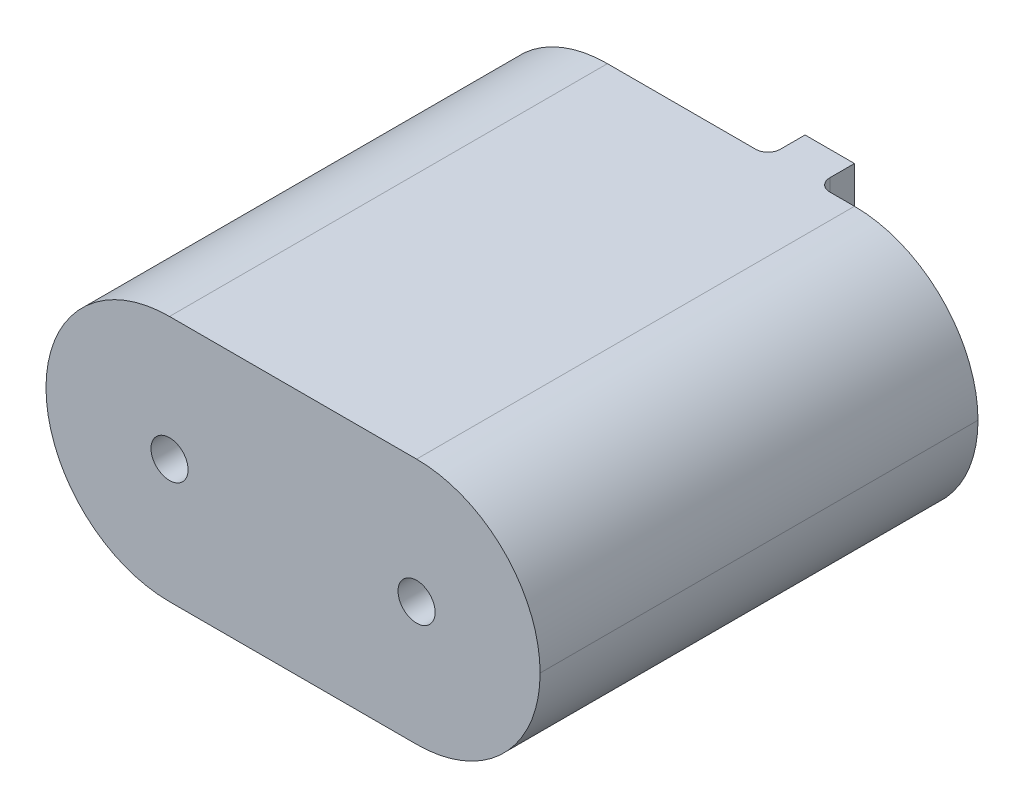
ISO-10303-21;
HEADER;
FILE_DESCRIPTION(('STEP AP214'),'2;1');
FILE_NAME('part.step','',(''),(''),'','','');
FILE_SCHEMA(('AUTOMOTIVE_DESIGN { 1 0 10303 214 1 1 1 1 }'));
ENDSEC;
DATA;
#1=APPLICATION_CONTEXT('core data for automotive mechanical design processes');
#2=APPLICATION_PROTOCOL_DEFINITION('international standard','automotive_design',2000,#1);
#3=PRODUCT_CONTEXT('',#1,'mechanical');
#4=PRODUCT('Part','Part','',(#3));
#5=PRODUCT_RELATED_PRODUCT_CATEGORY('part','',(#4));
#6=PRODUCT_DEFINITION_FORMATION('','',#4);
#7=PRODUCT_DEFINITION_CONTEXT('part definition',#1,'design');
#8=PRODUCT_DEFINITION('design','',#6,#7);
#9=PRODUCT_DEFINITION_SHAPE('','',#8);
#10=(LENGTH_UNIT() NAMED_UNIT(*) SI_UNIT(.MILLI.,.METRE.));
#11=(NAMED_UNIT(*) PLANE_ANGLE_UNIT() SI_UNIT($,.RADIAN.));
#12=(NAMED_UNIT(*) SI_UNIT($,.STERADIAN.) SOLID_ANGLE_UNIT());
#13=UNCERTAINTY_MEASURE_WITH_UNIT(LENGTH_MEASURE(1.E-05),#10,'distance_accuracy_value','');
#14=(GEOMETRIC_REPRESENTATION_CONTEXT(3) GLOBAL_UNCERTAINTY_ASSIGNED_CONTEXT((#13)) GLOBAL_UNIT_ASSIGNED_CONTEXT((#10,
#11,#12)) REPRESENTATION_CONTEXT('',''));
#15=CARTESIAN_POINT('',(0.,0.,0.));
#16=DIRECTION('',(0.,0.,1.));
#17=DIRECTION('',(1.,0.,0.));
#18=AXIS2_PLACEMENT_3D('',#15,#16,#17);
#19=CARTESIAN_POINT('',(3.,0.,-20.725));
#20=DIRECTION('',(-1.,0.,0.));
#21=DIRECTION('',(0.,-1.,0.));
#22=AXIS2_PLACEMENT_3D('',#19,#20,#21);
#23=PLANE('',#22);
#24=DIRECTION('',(0.,0.,1.));
#25=VECTOR('',#24,1.);
#26=CARTESIAN_POINT('',(3.,0.,-20.725));
#27=LINE('',#26,#25);
#28=CARTESIAN_POINT('',(3.,0.,-20.725));
#29=VERTEX_POINT('',#28);
#30=CARTESIAN_POINT('',(3.,0.,-18.725));
#31=VERTEX_POINT('',#30);
#32=EDGE_CURVE('E201',#29,#31,#27,.T.);
#33=ORIENTED_EDGE('',*,*,#32,.T.);
#34=DIRECTION('',(0.,-1.,0.));
#35=VECTOR('',#34,1.);
#36=CARTESIAN_POINT('',(3.,0.,-18.725));
#37=LINE('',#36,#35);
#38=CARTESIAN_POINT('',(3.,5.,-18.725));
#39=VERTEX_POINT('',#38);
#40=EDGE_CURVE('E285',#31,#39,#37,.F.);
#41=ORIENTED_EDGE('',*,*,#40,.T.);
#42=DIRECTION('',(0.,0.,1.));
#43=VECTOR('',#42,1.);
#44=CARTESIAN_POINT('',(3.,5.,-20.725));
#45=LINE('',#44,#43);
#46=CARTESIAN_POINT('',(3.,5.,-20.725));
#47=VERTEX_POINT('',#46);
#48=EDGE_CURVE('E326',#47,#39,#45,.T.);
#49=ORIENTED_EDGE('',*,*,#48,.F.);
#50=DIRECTION('',(0.,-1.,0.));
#51=VECTOR('',#50,1.);
#52=CARTESIAN_POINT('',(3.,0.,-20.725));
#53=LINE('',#52,#51);
#54=EDGE_CURVE('E325',#47,#29,#53,.T.);
#55=ORIENTED_EDGE('',*,*,#54,.T.);
#56=EDGE_LOOP('',(#33,#41,#49,#55));
#57=FACE_BOUND('',#56,.T.);
#58=ADVANCED_FACE('F48',(#57),#23,.T.);
#59=CARTESIAN_POINT('',(7.,0.,-20.725));
#60=DIRECTION('',(-1.,0.,0.));
#61=DIRECTION('',(0.,-1.,0.));
#62=AXIS2_PLACEMENT_3D('',#59,#60,#61);
#63=PLANE('',#62);
#64=DIRECTION('',(0.,0.,1.));
#65=VECTOR('',#64,1.);
#66=CARTESIAN_POINT('',(7.,5.,-20.725));
#67=LINE('',#66,#65);
#68=CARTESIAN_POINT('',(7.,5.,-20.725));
#69=VERTEX_POINT('',#68);
#70=CARTESIAN_POINT('',(7.,5.,-18.725));
#71=VERTEX_POINT('',#70);
#72=EDGE_CURVE('E330',#69,#71,#67,.T.);
#73=ORIENTED_EDGE('',*,*,#72,.T.);
#74=DIRECTION('',(0.,-1.,0.));
#75=VECTOR('',#74,1.);
#76=CARTESIAN_POINT('',(7.,0.,-18.725));
#77=LINE('',#76,#75);
#78=CARTESIAN_POINT('',(7.,0.,-18.725));
#79=VERTEX_POINT('',#78);
#80=EDGE_CURVE('E287',#71,#79,#77,.T.);
#81=ORIENTED_EDGE('',*,*,#80,.T.);
#82=DIRECTION('',(0.,0.,1.));
#83=VECTOR('',#82,1.);
#84=CARTESIAN_POINT('',(7.,0.,-20.725));
#85=LINE('',#84,#83);
#86=CARTESIAN_POINT('',(7.,0.,-20.725));
#87=VERTEX_POINT('',#86);
#88=EDGE_CURVE('E208',#87,#79,#85,.T.);
#89=ORIENTED_EDGE('',*,*,#88,.F.);
#90=DIRECTION('',(0.,-1.,0.));
#91=VECTOR('',#90,1.);
#92=CARTESIAN_POINT('',(7.,0.,-20.725));
#93=LINE('',#92,#91);
#94=EDGE_CURVE('E198',#69,#87,#93,.T.);
#95=ORIENTED_EDGE('',*,*,#94,.F.);
#96=EDGE_LOOP('',(#73,#81,#89,#95));
#97=FACE_BOUND('',#96,.T.);
#98=ADVANCED_FACE('F359',(#97),#63,.F.);
#99=CARTESIAN_POINT('',(0.,0.,-20.725));
#100=DIRECTION('',(0.,0.,-1.));
#101=DIRECTION('',(-1.,0.,0.));
#102=AXIS2_PLACEMENT_3D('',#99,#100,#101);
#103=PLANE('',#102);
#104=DIRECTION('',(-1.,0.,0.));
#105=VECTOR('',#104,1.);
#106=CARTESIAN_POINT('',(0.,5.,-20.725));
#107=LINE('',#106,#105);
#108=EDGE_CURVE('E190',#69,#47,#107,.T.);
#109=ORIENTED_EDGE('',*,*,#108,.F.);
#110=ORIENTED_EDGE('',*,*,#94,.T.);
#111=DIRECTION('',(-1.,0.,0.));
#112=VECTOR('',#111,1.);
#113=CARTESIAN_POINT('',(0.,0.,-20.725));
#114=LINE('',#113,#112);
#115=EDGE_CURVE('E197',#87,#29,#114,.T.);
#116=ORIENTED_EDGE('',*,*,#115,.T.);
#117=ORIENTED_EDGE('',*,*,#54,.F.);
#118=EDGE_LOOP('',(#109,#110,#116,#117));
#119=FACE_BOUND('',#118,.T.);
#120=ADVANCED_FACE('F354',(#119),#103,.T.);
#121=CARTESIAN_POINT('',(-20.,20.,-17.725));
#122=DIRECTION('',(0.,0.,1.));
#123=DIRECTION('',(1.,0.,0.));
#124=AXIS2_PLACEMENT_3D('',#121,#122,#123);
#125=PLANE('',#124);
#126=DIRECTION('',(-1.,0.,0.));
#127=VECTOR('',#126,1.);
#128=CARTESIAN_POINT('',(13.7521469424969,5.,-17.725));
#129=LINE('',#128,#127);
#130=CARTESIAN_POINT('',(8.,5.,-17.725));
#131=VERTEX_POINT('',#130);
#132=CARTESIAN_POINT('',(2.,5.,-17.725));
#133=VERTEX_POINT('',#132);
#134=EDGE_CURVE('E182',#131,#133,#129,.T.);
#135=ORIENTED_EDGE('',*,*,#134,.T.);
#136=DIRECTION('',(0.,-1.,0.));
#137=VECTOR('',#136,1.);
#138=CARTESIAN_POINT('',(2.,20.,-17.725));
#139=LINE('',#138,#137);
#140=CARTESIAN_POINT('',(1.99999999999999,0.,-17.725));
#141=VERTEX_POINT('',#140);
#142=EDGE_CURVE('E282',#133,#141,#139,.T.);
#143=ORIENTED_EDGE('',*,*,#142,.T.);
#144=DIRECTION('',(-1.,0.,0.));
#145=VECTOR('',#144,1.);
#146=CARTESIAN_POINT('',(-20.,0.,-17.725));
#147=LINE('',#146,#145);
#148=CARTESIAN_POINT('',(-10.,0.,-17.725));
#149=VERTEX_POINT('',#148);
#150=EDGE_CURVE('E234',#141,#149,#147,.T.);
#151=ORIENTED_EDGE('',*,*,#150,.T.);
#152=CARTESIAN_POINT('',(-10.,10.,-17.725));
#153=DIRECTION('',(0.,0.,1.));
#154=DIRECTION('',(1.,0.,0.));
#155=AXIS2_PLACEMENT_3D('',#152,#153,#154);
#156=CIRCLE('',#155,10.);
#157=CARTESIAN_POINT('',(-20.,10.,-17.725));
#158=VERTEX_POINT('',#157);
#159=EDGE_CURVE('E257',#149,#158,#156,.F.);
#160=ORIENTED_EDGE('',*,*,#159,.T.);
#161=CARTESIAN_POINT('',(-10.,10.,-17.725));
#162=DIRECTION('',(0.,0.,1.));
#163=DIRECTION('',(1.,0.,0.));
#164=AXIS2_PLACEMENT_3D('',#161,#162,#163);
#165=CIRCLE('',#164,10.);
#166=CARTESIAN_POINT('',(-10.,20.,-17.725));
#167=VERTEX_POINT('',#166);
#168=EDGE_CURVE('E254',#158,#167,#165,.F.);
#169=ORIENTED_EDGE('',*,*,#168,.T.);
#170=DIRECTION('',(-1.,0.,0.));
#171=VECTOR('',#170,1.);
#172=CARTESIAN_POINT('',(-20.,20.,-17.725));
#173=LINE('',#172,#171);
#174=CARTESIAN_POINT('',(2.,20.,-17.725));
#175=VERTEX_POINT('',#174);
#176=EDGE_CURVE('E226',#175,#167,#173,.T.);
#177=ORIENTED_EDGE('',*,*,#176,.F.);
#178=DIRECTION('',(0.,-1.,0.));
#179=VECTOR('',#178,1.);
#180=CARTESIAN_POINT('',(2.,20.,-17.725));
#181=LINE('',#180,#179);
#182=CARTESIAN_POINT('',(2.,15.,-17.725));
#183=VERTEX_POINT('',#182);
#184=EDGE_CURVE('E274',#175,#183,#181,.T.);
#185=ORIENTED_EDGE('',*,*,#184,.T.);
#186=DIRECTION('',(1.,0.,0.));
#187=VECTOR('',#186,1.);
#188=CARTESIAN_POINT('',(13.7521469424969,15.,-17.725));
#189=LINE('',#188,#187);
#190=CARTESIAN_POINT('',(8.,15.,-17.725));
#191=VERTEX_POINT('',#190);
#192=EDGE_CURVE('E311',#183,#191,#189,.T.);
#193=ORIENTED_EDGE('',*,*,#192,.T.);
#194=DIRECTION('',(0.,-1.,0.));
#195=VECTOR('',#194,1.);
#196=CARTESIAN_POINT('',(8.,20.,-17.725));
#197=LINE('',#196,#195);
#198=CARTESIAN_POINT('',(8.,20.,-17.725));
#199=VERTEX_POINT('',#198);
#200=EDGE_CURVE('E277',#191,#199,#197,.F.);
#201=ORIENTED_EDGE('',*,*,#200,.T.);
#202=CARTESIAN_POINT('',(9.99999999999999,20.,-17.725));
#203=VERTEX_POINT('',#202);
#204=EDGE_CURVE('E222',#203,#199,#173,.T.);
#205=ORIENTED_EDGE('',*,*,#204,.F.);
#206=CARTESIAN_POINT('',(10.,10.,-17.725));
#207=DIRECTION('',(0.,0.,1.));
#208=DIRECTION('',(1.,0.,0.));
#209=AXIS2_PLACEMENT_3D('',#206,#207,#208);
#210=CIRCLE('',#209,10.);
#211=CARTESIAN_POINT('',(20.,10.,-17.725));
#212=VERTEX_POINT('',#211);
#213=EDGE_CURVE('E250',#203,#212,#210,.F.);
#214=ORIENTED_EDGE('',*,*,#213,.T.);
#215=CARTESIAN_POINT('',(10.,10.,-17.725));
#216=DIRECTION('',(0.,0.,1.));
#217=DIRECTION('',(1.,0.,0.));
#218=AXIS2_PLACEMENT_3D('',#215,#216,#217);
#219=CIRCLE('',#218,10.);
#220=CARTESIAN_POINT('',(9.99999999999999,0.,-17.725));
#221=VERTEX_POINT('',#220);
#222=EDGE_CURVE('E252',#212,#221,#219,.F.);
#223=ORIENTED_EDGE('',*,*,#222,.T.);
#224=CARTESIAN_POINT('',(8.,0.,-17.725));
#225=VERTEX_POINT('',#224);
#226=EDGE_CURVE('E230',#221,#225,#147,.T.);
#227=ORIENTED_EDGE('',*,*,#226,.T.);
#228=DIRECTION('',(0.,-1.,0.));
#229=VECTOR('',#228,1.);
#230=CARTESIAN_POINT('',(8.,5.,-17.725));
#231=LINE('',#230,#229);
#232=EDGE_CURVE('E279',#225,#131,#231,.F.);
#233=ORIENTED_EDGE('',*,*,#232,.T.);
#234=EDGE_LOOP('',(#135,#143,#151,#160,#169,#177,#185,#193,#201,#205,#214,#223,#227,#233));
#235=FACE_BOUND('',#234,.T.);
#236=CARTESIAN_POINT('',(-10.,10.,-17.725));
#237=DIRECTION('',(0.,0.,-1.));
#238=DIRECTION('',(-1.,0.,0.));
#239=AXIS2_PLACEMENT_3D('',#236,#237,#238);
#240=CIRCLE('',#239,1.5);
#241=CARTESIAN_POINT('',(-11.5,10.,-17.725));
#242=VERTEX_POINT('',#241);
#243=EDGE_CURVE('E215',#242,#242,#240,.T.);
#244=ORIENTED_EDGE('',*,*,#243,.F.);
#245=EDGE_LOOP('',(#244));
#246=FACE_BOUND('',#245,.T.);
#247=CARTESIAN_POINT('',(10.,10.,-17.725));
#248=DIRECTION('',(0.,0.,-1.));
#249=DIRECTION('',(-1.,0.,0.));
#250=AXIS2_PLACEMENT_3D('',#247,#248,#249);
#251=CIRCLE('',#250,1.5);
#252=CARTESIAN_POINT('',(8.5,10.,-17.725));
#253=VERTEX_POINT('',#252);
#254=EDGE_CURVE('E216',#253,#253,#251,.T.);
#255=ORIENTED_EDGE('',*,*,#254,.F.);
#256=EDGE_LOOP('',(#255));
#257=FACE_BOUND('',#256,.T.);
#258=ADVANCED_FACE('F318',(#235,#246,#257),#125,.F.);
#259=CARTESIAN_POINT('',(-20.,20.,17.725));
#260=DIRECTION('',(0.,0.,-1.));
#261=DIRECTION('',(-1.,0.,0.));
#262=AXIS2_PLACEMENT_3D('',#259,#260,#261);
#263=PLANE('',#262);
#264=CARTESIAN_POINT('',(10.,10.,17.725));
#265=DIRECTION('',(0.,0.,-1.));
#266=DIRECTION('',(-1.,0.,0.));
#267=AXIS2_PLACEMENT_3D('',#264,#265,#266);
#268=CIRCLE('',#267,1.5);
#269=CARTESIAN_POINT('',(8.5,10.,17.725));
#270=VERTEX_POINT('',#269);
#271=EDGE_CURVE('E268',#270,#270,#268,.T.);
#272=ORIENTED_EDGE('',*,*,#271,.T.);
#273=EDGE_LOOP('',(#272));
#274=FACE_BOUND('',#273,.T.);
#275=CARTESIAN_POINT('',(-10.,10.,17.725));
#276=DIRECTION('',(0.,0.,-1.));
#277=DIRECTION('',(-1.,0.,0.));
#278=AXIS2_PLACEMENT_3D('',#275,#276,#277);
#279=CIRCLE('',#278,1.5);
#280=CARTESIAN_POINT('',(-11.5,10.,17.725));
#281=VERTEX_POINT('',#280);
#282=EDGE_CURVE('E219',#281,#281,#279,.T.);
#283=ORIENTED_EDGE('',*,*,#282,.T.);
#284=EDGE_LOOP('',(#283));
#285=FACE_BOUND('',#284,.T.);
#286=CARTESIAN_POINT('',(-10.,10.,17.725));
#287=DIRECTION('',(0.,0.,-1.));
#288=DIRECTION('',(-1.,0.,0.));
#289=AXIS2_PLACEMENT_3D('',#286,#287,#288);
#290=CIRCLE('',#289,10.);
#291=CARTESIAN_POINT('',(-10.,20.,17.725));
#292=VERTEX_POINT('',#291);
#293=CARTESIAN_POINT('',(-20.,10.,17.725));
#294=VERTEX_POINT('',#293);
#295=EDGE_CURVE('E240',#292,#294,#290,.F.);
#296=ORIENTED_EDGE('',*,*,#295,.T.);
#297=CARTESIAN_POINT('',(-10.,10.,17.725));
#298=DIRECTION('',(0.,0.,-1.));
#299=DIRECTION('',(-1.,0.,0.));
#300=AXIS2_PLACEMENT_3D('',#297,#298,#299);
#301=CIRCLE('',#300,10.);
#302=CARTESIAN_POINT('',(-10.,0.,17.725));
#303=VERTEX_POINT('',#302);
#304=EDGE_CURVE('E242',#294,#303,#301,.F.);
#305=ORIENTED_EDGE('',*,*,#304,.T.);
#306=DIRECTION('',(1.,0.,0.));
#307=VECTOR('',#306,1.);
#308=CARTESIAN_POINT('',(-20.,0.,17.725));
#309=LINE('',#308,#307);
#310=CARTESIAN_POINT('',(10.,0.,17.725));
#311=VERTEX_POINT('',#310);
#312=EDGE_CURVE('E233',#303,#311,#309,.T.);
#313=ORIENTED_EDGE('',*,*,#312,.T.);
#314=CARTESIAN_POINT('',(10.,10.,17.725));
#315=DIRECTION('',(0.,0.,-1.));
#316=DIRECTION('',(-1.,0.,0.));
#317=AXIS2_PLACEMENT_3D('',#314,#315,#316);
#318=CIRCLE('',#317,10.);
#319=CARTESIAN_POINT('',(20.,10.,17.725));
#320=VERTEX_POINT('',#319);
#321=EDGE_CURVE('E238',#311,#320,#318,.F.);
#322=ORIENTED_EDGE('',*,*,#321,.T.);
#323=CARTESIAN_POINT('',(10.,10.,17.725));
#324=DIRECTION('',(0.,0.,-1.));
#325=DIRECTION('',(-1.,0.,0.));
#326=AXIS2_PLACEMENT_3D('',#323,#324,#325);
#327=CIRCLE('',#326,10.);
#328=CARTESIAN_POINT('',(10.,20.,17.725));
#329=VERTEX_POINT('',#328);
#330=EDGE_CURVE('E229',#320,#329,#327,.F.);
#331=ORIENTED_EDGE('',*,*,#330,.T.);
#332=DIRECTION('',(1.,0.,0.));
#333=VECTOR('',#332,1.);
#334=CARTESIAN_POINT('',(-20.,20.,17.725));
#335=LINE('',#334,#333);
#336=EDGE_CURVE('E225',#292,#329,#335,.T.);
#337=ORIENTED_EDGE('',*,*,#336,.F.);
#338=EDGE_LOOP('',(#296,#305,#313,#322,#331,#337));
#339=FACE_BOUND('',#338,.T.);
#340=ADVANCED_FACE('F395',(#274,#285,#339),#263,.F.);
#341=CARTESIAN_POINT('',(0.,20.,0.));
#342=DIRECTION('',(0.,1.,0.));
#343=DIRECTION('',(0.,0.,1.));
#344=AXIS2_PLACEMENT_3D('',#341,#342,#343);
#345=PLANE('',#344);
#346=ORIENTED_EDGE('',*,*,#204,.T.);
#347=CARTESIAN_POINT('',(8.,20.,-18.725));
#348=DIRECTION('',(0.,1.,0.));
#349=DIRECTION('',(0.,0.,1.));
#350=AXIS2_PLACEMENT_3D('',#347,#348,#349);
#351=CIRCLE('',#350,1.);
#352=CARTESIAN_POINT('',(7.,20.,-18.725));
#353=VERTEX_POINT('',#352);
#354=EDGE_CURVE('E303',#199,#353,#351,.F.);
#355=ORIENTED_EDGE('',*,*,#354,.T.);
#356=DIRECTION('',(0.,0.,1.));
#357=VECTOR('',#356,1.);
#358=CARTESIAN_POINT('',(7.,20.,-20.725));
#359=LINE('',#358,#357);
#360=CARTESIAN_POINT('',(7.,20.,-20.725));
#361=VERTEX_POINT('',#360);
#362=EDGE_CURVE('E211',#361,#353,#359,.T.);
#363=ORIENTED_EDGE('',*,*,#362,.F.);
#364=DIRECTION('',(1.,0.,0.));
#365=VECTOR('',#364,1.);
#366=CARTESIAN_POINT('',(0.,20.,-20.725));
#367=LINE('',#366,#365);
#368=CARTESIAN_POINT('',(3.,20.,-20.725));
#369=VERTEX_POINT('',#368);
#370=EDGE_CURVE('E195',#369,#361,#367,.T.);
#371=ORIENTED_EDGE('',*,*,#370,.F.);
#372=DIRECTION('',(0.,0.,1.));
#373=VECTOR('',#372,1.);
#374=CARTESIAN_POINT('',(3.,20.,-20.725));
#375=LINE('',#374,#373);
#376=CARTESIAN_POINT('',(3.,20.,-18.725));
#377=VERTEX_POINT('',#376);
#378=EDGE_CURVE('E213',#369,#377,#375,.T.);
#379=ORIENTED_EDGE('',*,*,#378,.T.);
#380=CARTESIAN_POINT('',(2.,20.,-18.725));
#381=DIRECTION('',(0.,1.,0.));
#382=DIRECTION('',(0.,0.,1.));
#383=AXIS2_PLACEMENT_3D('',#380,#381,#382);
#384=CIRCLE('',#383,1.);
#385=EDGE_CURVE('E11',#377,#175,#384,.F.);
#386=ORIENTED_EDGE('',*,*,#385,.T.);
#387=ORIENTED_EDGE('',*,*,#176,.T.);
#388=DIRECTION('',(0.,0.,1.));
#389=VECTOR('',#388,1.);
#390=CARTESIAN_POINT('',(-10.,20.,17.725));
#391=LINE('',#390,#389);
#392=EDGE_CURVE('E191',#167,#292,#391,.T.);
#393=ORIENTED_EDGE('',*,*,#392,.T.);
#394=ORIENTED_EDGE('',*,*,#336,.T.);
#395=DIRECTION('',(0.,0.,-1.));
#396=VECTOR('',#395,1.);
#397=CARTESIAN_POINT('',(10.,20.,-17.725));
#398=LINE('',#397,#396);
#399=EDGE_CURVE('E259',#329,#203,#398,.T.);
#400=ORIENTED_EDGE('',*,*,#399,.T.);
#401=EDGE_LOOP('',(#346,#355,#363,#371,#379,#386,#387,#393,#394,#400));
#402=FACE_BOUND('',#401,.T.);
#403=ADVANCED_FACE('F306',(#402),#345,.T.);
#404=CARTESIAN_POINT('',(0.,0.,0.));
#405=DIRECTION('',(0.,1.,0.));
#406=DIRECTION('',(0.,0.,1.));
#407=AXIS2_PLACEMENT_3D('',#404,#405,#406);
#408=PLANE('',#407);
#409=ORIENTED_EDGE('',*,*,#312,.F.);
#410=DIRECTION('',(0.,0.,1.));
#411=VECTOR('',#410,1.);
#412=CARTESIAN_POINT('',(-10.,0.,0.));
#413=LINE('',#412,#411);
#414=EDGE_CURVE('E247',#303,#149,#413,.F.);
#415=ORIENTED_EDGE('',*,*,#414,.T.);
#416=ORIENTED_EDGE('',*,*,#150,.F.);
#417=CARTESIAN_POINT('',(2.,0.,-18.725));
#418=DIRECTION('',(0.,1.,0.));
#419=DIRECTION('',(0.,0.,1.));
#420=AXIS2_PLACEMENT_3D('',#417,#418,#419);
#421=CIRCLE('',#420,1.);
#422=EDGE_CURVE('E292',#141,#31,#421,.T.);
#423=ORIENTED_EDGE('',*,*,#422,.T.);
#424=ORIENTED_EDGE('',*,*,#32,.F.);
#425=ORIENTED_EDGE('',*,*,#115,.F.);
#426=ORIENTED_EDGE('',*,*,#88,.T.);
#427=CARTESIAN_POINT('',(8.,0.,-18.725));
#428=DIRECTION('',(0.,1.,0.));
#429=DIRECTION('',(0.,0.,1.));
#430=AXIS2_PLACEMENT_3D('',#427,#428,#429);
#431=CIRCLE('',#430,1.);
#432=EDGE_CURVE('E297',#79,#225,#431,.T.);
#433=ORIENTED_EDGE('',*,*,#432,.T.);
#434=ORIENTED_EDGE('',*,*,#226,.F.);
#435=DIRECTION('',(0.,0.,-1.));
#436=VECTOR('',#435,1.);
#437=CARTESIAN_POINT('',(10.,0.,0.));
#438=LINE('',#437,#436);
#439=EDGE_CURVE('E244',#221,#311,#438,.F.);
#440=ORIENTED_EDGE('',*,*,#439,.T.);
#441=EDGE_LOOP('',(#409,#415,#416,#423,#424,#425,#426,#433,#434,#440));
#442=FACE_BOUND('',#441,.T.);
#443=ADVANCED_FACE('F348',(#442),#408,.F.);
#444=CARTESIAN_POINT('',(-10.,10.,0.));
#445=DIRECTION('',(0.,0.,-1.));
#446=DIRECTION('',(-1.,0.,0.));
#447=AXIS2_PLACEMENT_3D('',#444,#445,#446);
#448=CYLINDRICAL_SURFACE('',#447,10.);
#449=ORIENTED_EDGE('',*,*,#392,.F.);
#450=ORIENTED_EDGE('',*,*,#168,.F.);
#451=DIRECTION('',(0.,0.,1.));
#452=VECTOR('',#451,1.);
#453=CARTESIAN_POINT('',(-20.,10.,-17.725));
#454=LINE('',#453,#452);
#455=EDGE_CURVE('E262',#294,#158,#454,.F.);
#456=ORIENTED_EDGE('',*,*,#455,.F.);
#457=ORIENTED_EDGE('',*,*,#295,.F.);
#458=EDGE_LOOP('',(#449,#450,#456,#457));
#459=FACE_BOUND('',#458,.T.);
#460=ADVANCED_FACE('F398',(#459),#448,.T.);
#461=CARTESIAN_POINT('',(-10.,10.,-17.725));
#462=DIRECTION('',(0.,0.,1.));
#463=DIRECTION('',(1.,0.,0.));
#464=AXIS2_PLACEMENT_3D('',#461,#462,#463);
#465=CYLINDRICAL_SURFACE('',#464,10.);
#466=ORIENTED_EDGE('',*,*,#159,.F.);
#467=ORIENTED_EDGE('',*,*,#414,.F.);
#468=ORIENTED_EDGE('',*,*,#304,.F.);
#469=ORIENTED_EDGE('',*,*,#455,.T.);
#470=EDGE_LOOP('',(#466,#467,#468,#469));
#471=FACE_BOUND('',#470,.T.);
#472=ADVANCED_FACE('F404',(#471),#465,.T.);
#473=CARTESIAN_POINT('',(10.,10.,0.));
#474=DIRECTION('',(0.,0.,1.));
#475=DIRECTION('',(1.,0.,0.));
#476=AXIS2_PLACEMENT_3D('',#473,#474,#475);
#477=CYLINDRICAL_SURFACE('',#476,10.);
#478=ORIENTED_EDGE('',*,*,#399,.F.);
#479=ORIENTED_EDGE('',*,*,#330,.F.);
#480=DIRECTION('',(0.,0.,-1.));
#481=VECTOR('',#480,1.);
#482=CARTESIAN_POINT('',(20.,10.,17.725));
#483=LINE('',#482,#481);
#484=EDGE_CURVE('E265',#212,#320,#483,.F.);
#485=ORIENTED_EDGE('',*,*,#484,.F.);
#486=ORIENTED_EDGE('',*,*,#213,.F.);
#487=EDGE_LOOP('',(#478,#479,#485,#486));
#488=FACE_BOUND('',#487,.T.);
#489=ADVANCED_FACE('F407',(#488),#477,.T.);
#490=CARTESIAN_POINT('',(10.,10.,-17.725));
#491=DIRECTION('',(0.,0.,-1.));
#492=DIRECTION('',(-1.,0.,0.));
#493=AXIS2_PLACEMENT_3D('',#490,#491,#492);
#494=CYLINDRICAL_SURFACE('',#493,10.);
#495=ORIENTED_EDGE('',*,*,#321,.F.);
#496=ORIENTED_EDGE('',*,*,#439,.F.);
#497=ORIENTED_EDGE('',*,*,#222,.F.);
#498=ORIENTED_EDGE('',*,*,#484,.T.);
#499=EDGE_LOOP('',(#495,#496,#497,#498));
#500=FACE_BOUND('',#499,.T.);
#501=ADVANCED_FACE('F388',(#500),#494,.T.);
#502=CARTESIAN_POINT('',(-10.,10.,59.275));
#503=DIRECTION('',(0.,0.,-1.));
#504=DIRECTION('',(-1.,0.,0.));
#505=AXIS2_PLACEMENT_3D('',#502,#503,#504);
#506=CYLINDRICAL_SURFACE('',#505,1.5);
#507=ORIENTED_EDGE('',*,*,#243,.T.);
#508=EDGE_LOOP('',(#507));
#509=FACE_BOUND('',#508,.T.);
#510=ORIENTED_EDGE('',*,*,#282,.F.);
#511=EDGE_LOOP('',(#510));
#512=FACE_BOUND('',#511,.T.);
#513=ADVANCED_FACE('F383',(#509,#512),#506,.F.);
#514=CARTESIAN_POINT('',(10.,10.,59.275));
#515=DIRECTION('',(0.,0.,-1.));
#516=DIRECTION('',(-1.,0.,0.));
#517=AXIS2_PLACEMENT_3D('',#514,#515,#516);
#518=CYLINDRICAL_SURFACE('',#517,1.5);
#519=ORIENTED_EDGE('',*,*,#254,.T.);
#520=EDGE_LOOP('',(#519));
#521=FACE_BOUND('',#520,.T.);
#522=ORIENTED_EDGE('',*,*,#271,.F.);
#523=EDGE_LOOP('',(#522));
#524=FACE_BOUND('',#523,.T.);
#525=ADVANCED_FACE('F378',(#521,#524),#518,.F.);
#526=DIRECTION('',(0.,0.,-1.));
#527=VECTOR('',#526,1.);
#528=CARTESIAN_POINT('',(3.,15.,-20.725));
#529=LINE('',#528,#527);
#530=CARTESIAN_POINT('',(3.,15.,-18.725));
#531=VERTEX_POINT('',#530);
#532=CARTESIAN_POINT('',(3.,15.,-20.725));
#533=VERTEX_POINT('',#532);
#534=EDGE_CURVE('E181',#531,#533,#529,.T.);
#535=ORIENTED_EDGE('',*,*,#534,.F.);
#536=DIRECTION('',(0.,-1.,0.));
#537=VECTOR('',#536,1.);
#538=CARTESIAN_POINT('',(3.,0.,-18.725));
#539=LINE('',#538,#537);
#540=EDGE_CURVE('E63',#531,#377,#539,.F.);
#541=ORIENTED_EDGE('',*,*,#540,.T.);
#542=ORIENTED_EDGE('',*,*,#378,.F.);
#543=EDGE_CURVE('E324',#369,#533,#53,.T.);
#544=ORIENTED_EDGE('',*,*,#543,.T.);
#545=EDGE_LOOP('',(#535,#541,#542,#544));
#546=FACE_BOUND('',#545,.T.);
#547=ADVANCED_FACE('F323',(#546),#23,.T.);
#548=ORIENTED_EDGE('',*,*,#362,.T.);
#549=DIRECTION('',(0.,-1.,0.));
#550=VECTOR('',#549,1.);
#551=CARTESIAN_POINT('',(7.,15.,-18.725));
#552=LINE('',#551,#550);
#553=CARTESIAN_POINT('',(7.,15.,-18.725));
#554=VERTEX_POINT('',#553);
#555=EDGE_CURVE('E179',#353,#554,#552,.T.);
#556=ORIENTED_EDGE('',*,*,#555,.T.);
#557=DIRECTION('',(0.,0.,-1.));
#558=VECTOR('',#557,1.);
#559=CARTESIAN_POINT('',(7.,15.,-20.725));
#560=LINE('',#559,#558);
#561=CARTESIAN_POINT('',(7.,15.,-20.725));
#562=VERTEX_POINT('',#561);
#563=EDGE_CURVE('E172',#554,#562,#560,.T.);
#564=ORIENTED_EDGE('',*,*,#563,.T.);
#565=EDGE_CURVE('E177',#361,#562,#93,.T.);
#566=ORIENTED_EDGE('',*,*,#565,.F.);
#567=EDGE_LOOP('',(#548,#556,#564,#566));
#568=FACE_BOUND('',#567,.T.);
#569=ADVANCED_FACE('F175',(#568),#63,.F.);
#570=DIRECTION('',(1.,0.,0.));
#571=VECTOR('',#570,1.);
#572=CARTESIAN_POINT('',(0.,15.,-20.725));
#573=LINE('',#572,#571);
#574=EDGE_CURVE('E185',#533,#562,#573,.T.);
#575=ORIENTED_EDGE('',*,*,#574,.F.);
#576=ORIENTED_EDGE('',*,*,#543,.F.);
#577=ORIENTED_EDGE('',*,*,#370,.T.);
#578=ORIENTED_EDGE('',*,*,#565,.T.);
#579=EDGE_LOOP('',(#575,#576,#577,#578));
#580=FACE_BOUND('',#579,.T.);
#581=ADVANCED_FACE('F193',(#580),#103,.T.);
#582=CARTESIAN_POINT('',(13.7521469424969,5.,-17.725));
#583=DIRECTION('',(0.,-1.,0.));
#584=DIRECTION('',(1.,0.,0.));
#585=AXIS2_PLACEMENT_3D('',#582,#583,#584);
#586=PLANE('',#585);
#587=ORIENTED_EDGE('',*,*,#48,.T.);
#588=CARTESIAN_POINT('',(2.,5.,-18.725));
#589=DIRECTION('',(0.,-1.,0.));
#590=DIRECTION('',(1.,0.,0.));
#591=AXIS2_PLACEMENT_3D('',#588,#589,#590);
#592=CIRCLE('',#591,1.);
#593=EDGE_CURVE('E294',#39,#133,#592,.T.);
#594=ORIENTED_EDGE('',*,*,#593,.T.);
#595=ORIENTED_EDGE('',*,*,#134,.F.);
#596=CARTESIAN_POINT('',(8.,5.,-18.725));
#597=DIRECTION('',(0.,-1.,0.));
#598=DIRECTION('',(1.,0.,0.));
#599=AXIS2_PLACEMENT_3D('',#596,#597,#598);
#600=CIRCLE('',#599,1.);
#601=EDGE_CURVE('E299',#131,#71,#600,.T.);
#602=ORIENTED_EDGE('',*,*,#601,.T.);
#603=ORIENTED_EDGE('',*,*,#72,.F.);
#604=ORIENTED_EDGE('',*,*,#108,.T.);
#605=EDGE_LOOP('',(#587,#594,#595,#602,#603,#604));
#606=FACE_BOUND('',#605,.T.);
#607=ADVANCED_FACE('F340',(#606),#586,.F.);
#608=CARTESIAN_POINT('',(13.7521469424969,15.,-17.725));
#609=DIRECTION('',(0.,1.,0.));
#610=DIRECTION('',(0.,0.,1.));
#611=AXIS2_PLACEMENT_3D('',#608,#609,#610);
#612=PLANE('',#611);
#613=ORIENTED_EDGE('',*,*,#192,.F.);
#614=CARTESIAN_POINT('',(2.,15.,-18.725));
#615=DIRECTION('',(0.,1.,0.));
#616=DIRECTION('',(0.,0.,1.));
#617=AXIS2_PLACEMENT_3D('',#614,#615,#616);
#618=CIRCLE('',#617,1.);
#619=EDGE_CURVE('E56',#183,#531,#618,.T.);
#620=ORIENTED_EDGE('',*,*,#619,.T.);
#621=ORIENTED_EDGE('',*,*,#534,.T.);
#622=ORIENTED_EDGE('',*,*,#574,.T.);
#623=ORIENTED_EDGE('',*,*,#563,.F.);
#624=CARTESIAN_POINT('',(8.,15.,-18.725));
#625=DIRECTION('',(0.,1.,0.));
#626=DIRECTION('',(0.,0.,1.));
#627=AXIS2_PLACEMENT_3D('',#624,#625,#626);
#628=CIRCLE('',#627,1.);
#629=EDGE_CURVE('E301',#554,#191,#628,.T.);
#630=ORIENTED_EDGE('',*,*,#629,.T.);
#631=EDGE_LOOP('',(#613,#620,#621,#622,#623,#630));
#632=FACE_BOUND('',#631,.T.);
#633=ADVANCED_FACE('F186',(#632),#612,.F.);
#634=CARTESIAN_POINT('',(2.,20.,-18.725));
#635=DIRECTION('',(0.,-1.,0.));
#636=DIRECTION('',(1.,0.,0.));
#637=AXIS2_PLACEMENT_3D('',#634,#635,#636);
#638=CYLINDRICAL_SURFACE('',#637,1.);
#639=ORIENTED_EDGE('',*,*,#593,.F.);
#640=ORIENTED_EDGE('',*,*,#40,.F.);
#641=ORIENTED_EDGE('',*,*,#422,.F.);
#642=ORIENTED_EDGE('',*,*,#142,.F.);
#643=EDGE_LOOP('',(#639,#640,#641,#642));
#644=FACE_BOUND('',#643,.T.);
#645=ADVANCED_FACE('F344',(#644),#638,.F.);
#646=CARTESIAN_POINT('',(8.,0.,-18.725));
#647=DIRECTION('',(0.,1.,0.));
#648=DIRECTION('',(-1.,0.,0.));
#649=AXIS2_PLACEMENT_3D('',#646,#647,#648);
#650=CYLINDRICAL_SURFACE('',#649,1.);
#651=ORIENTED_EDGE('',*,*,#601,.F.);
#652=ORIENTED_EDGE('',*,*,#232,.F.);
#653=ORIENTED_EDGE('',*,*,#432,.F.);
#654=ORIENTED_EDGE('',*,*,#80,.F.);
#655=EDGE_LOOP('',(#651,#652,#653,#654));
#656=FACE_BOUND('',#655,.T.);
#657=ADVANCED_FACE('F362',(#656),#650,.F.);
#658=CARTESIAN_POINT('',(8.,0.,-18.725));
#659=DIRECTION('',(0.,1.,0.));
#660=DIRECTION('',(-1.,0.,0.));
#661=AXIS2_PLACEMENT_3D('',#658,#659,#660);
#662=CYLINDRICAL_SURFACE('',#661,1.);
#663=ORIENTED_EDGE('',*,*,#354,.F.);
#664=ORIENTED_EDGE('',*,*,#200,.F.);
#665=ORIENTED_EDGE('',*,*,#629,.F.);
#666=ORIENTED_EDGE('',*,*,#555,.F.);
#667=EDGE_LOOP('',(#663,#664,#665,#666));
#668=FACE_BOUND('',#667,.T.);
#669=ADVANCED_FACE('F310',(#668),#662,.F.);
#670=CARTESIAN_POINT('',(2.,20.,-18.725));
#671=DIRECTION('',(0.,-1.,0.));
#672=DIRECTION('',(1.,0.,0.));
#673=AXIS2_PLACEMENT_3D('',#670,#671,#672);
#674=CYLINDRICAL_SURFACE('',#673,1.);
#675=ORIENTED_EDGE('',*,*,#385,.F.);
#676=ORIENTED_EDGE('',*,*,#540,.F.);
#677=ORIENTED_EDGE('',*,*,#619,.F.);
#678=ORIENTED_EDGE('',*,*,#184,.F.);
#679=EDGE_LOOP('',(#675,#676,#677,#678));
#680=FACE_BOUND('',#679,.T.);
#681=ADVANCED_FACE('F50',(#680),#674,.F.);
#682=CLOSED_SHELL('',(#58,#98,#120,#258,#340,#403,#443,#460,#472,#489,#501,#513,#525,#547,#569,
#581,#607,#633,#645,#657,#669,#681));
#683=MANIFOLD_SOLID_BREP('B2',#682);
#684=ADVANCED_BREP_SHAPE_REPRESENTATION('',(#18,#683),#14);
#685=SHAPE_DEFINITION_REPRESENTATION(#9,#684);
ENDSEC;
END-ISO-10303-21;
